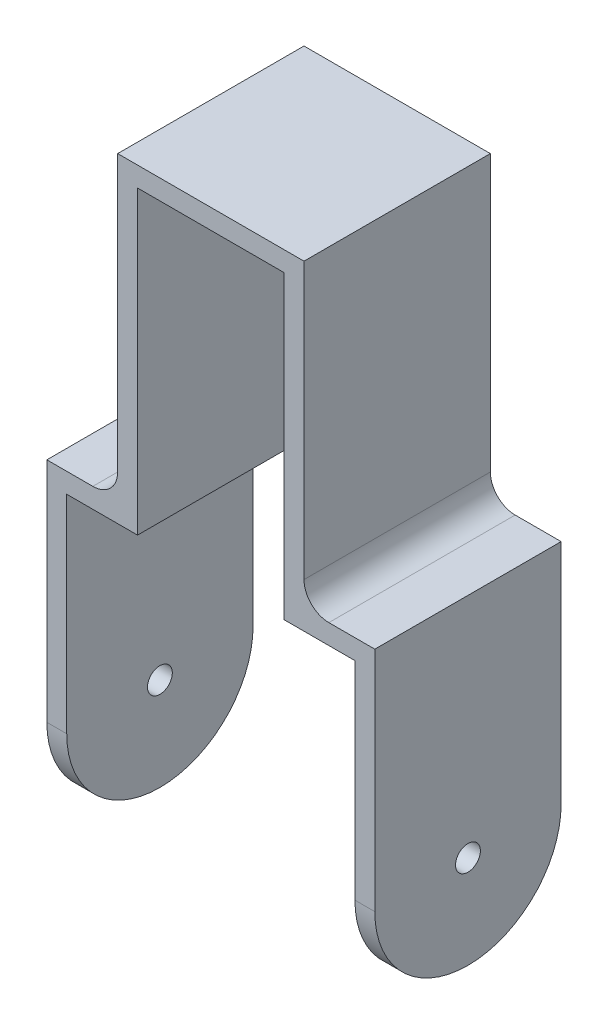
ISO-10303-21;
HEADER;
FILE_DESCRIPTION(('STEP AP214'),'2;1');
FILE_NAME('part.step','',(''),(''),'','','');
FILE_SCHEMA(('AUTOMOTIVE_DESIGN { 1 0 10303 214 1 1 1 1 }'));
ENDSEC;
DATA;
#1=APPLICATION_CONTEXT('core data for automotive mechanical design processes');
#2=APPLICATION_PROTOCOL_DEFINITION('international standard','automotive_design',2000,#1);
#3=PRODUCT_CONTEXT('',#1,'mechanical');
#4=PRODUCT('Part','Part','',(#3));
#5=PRODUCT_RELATED_PRODUCT_CATEGORY('part','',(#4));
#6=PRODUCT_DEFINITION_FORMATION('','',#4);
#7=PRODUCT_DEFINITION_CONTEXT('part definition',#1,'design');
#8=PRODUCT_DEFINITION('design','',#6,#7);
#9=PRODUCT_DEFINITION_SHAPE('','',#8);
#10=(LENGTH_UNIT() NAMED_UNIT(*) SI_UNIT(.MILLI.,.METRE.));
#11=(NAMED_UNIT(*) PLANE_ANGLE_UNIT() SI_UNIT($,.RADIAN.));
#12=(NAMED_UNIT(*) SI_UNIT($,.STERADIAN.) SOLID_ANGLE_UNIT());
#13=UNCERTAINTY_MEASURE_WITH_UNIT(LENGTH_MEASURE(1.E-05),#10,'distance_accuracy_value','');
#14=(GEOMETRIC_REPRESENTATION_CONTEXT(3) GLOBAL_UNCERTAINTY_ASSIGNED_CONTEXT((#13)) GLOBAL_UNIT_ASSIGNED_CONTEXT((#10,
#11,#12)) REPRESENTATION_CONTEXT('',''));
#15=CARTESIAN_POINT('',(0.,0.,0.));
#16=DIRECTION('',(0.,0.,1.));
#17=DIRECTION('',(1.,0.,0.));
#18=AXIS2_PLACEMENT_3D('',#15,#16,#17);
#19=CARTESIAN_POINT('',(-20.5,0.,75.));
#20=DIRECTION('',(1.,0.,0.));
#21=DIRECTION('',(0.,1.,0.));
#22=AXIS2_PLACEMENT_3D('',#19,#20,#21);
#23=PLANE('',#22);
#24=CARTESIAN_POINT('',(-20.5,-212.5,37.5));
#25=DIRECTION('',(1.,0.,0.));
#26=DIRECTION('',(0.,1.,0.));
#27=AXIS2_PLACEMENT_3D('',#24,#25,#26);
#28=CIRCLE('',#27,5.);
#29=CARTESIAN_POINT('',(-20.5,-207.5,37.5));
#30=VERTEX_POINT('',#29);
#31=EDGE_CURVE('E234',#30,#30,#28,.F.);
#32=ORIENTED_EDGE('',*,*,#31,.T.);
#33=EDGE_LOOP('',(#32));
#34=FACE_BOUND('',#33,.T.);
#35=DIRECTION('',(0.,-1.,0.));
#36=VECTOR('',#35,1.);
#37=CARTESIAN_POINT('',(-20.5,0.,75.));
#38=LINE('',#37,#36);
#39=CARTESIAN_POINT('',(-20.5,-129.,75.));
#40=VERTEX_POINT('',#39);
#41=CARTESIAN_POINT('',(-20.5,-212.5,75.));
#42=VERTEX_POINT('',#41);
#43=EDGE_CURVE('E174',#40,#42,#38,.T.);
#44=ORIENTED_EDGE('',*,*,#43,.T.);
#45=CARTESIAN_POINT('',(-20.5,-212.5,37.5));
#46=DIRECTION('',(1.,0.,0.));
#47=DIRECTION('',(0.,1.,0.));
#48=AXIS2_PLACEMENT_3D('',#45,#46,#47);
#49=CIRCLE('',#48,37.5);
#50=CARTESIAN_POINT('',(-20.5,-250.,37.5));
#51=VERTEX_POINT('',#50);
#52=EDGE_CURVE('E299',#42,#51,#49,.T.);
#53=ORIENTED_EDGE('',*,*,#52,.T.);
#54=CARTESIAN_POINT('',(-20.5,-212.5,37.5));
#55=DIRECTION('',(1.,0.,0.));
#56=DIRECTION('',(0.,1.,0.));
#57=AXIS2_PLACEMENT_3D('',#54,#55,#56);
#58=CIRCLE('',#57,37.5);
#59=CARTESIAN_POINT('',(-20.5,-212.5,0.));
#60=VERTEX_POINT('',#59);
#61=EDGE_CURVE('E297',#51,#60,#58,.T.);
#62=ORIENTED_EDGE('',*,*,#61,.T.);
#63=DIRECTION('',(0.,-1.,0.));
#64=VECTOR('',#63,1.);
#65=CARTESIAN_POINT('',(-20.5,0.,0.));
#66=LINE('',#65,#64);
#67=CARTESIAN_POINT('',(-20.5,-129.,0.));
#68=VERTEX_POINT('',#67);
#69=EDGE_CURVE('E176',#68,#60,#66,.T.);
#70=ORIENTED_EDGE('',*,*,#69,.F.);
#71=DIRECTION('',(0.,0.,-1.));
#72=VECTOR('',#71,1.);
#73=CARTESIAN_POINT('',(-20.5,-129.,75.));
#74=LINE('',#73,#72);
#75=EDGE_CURVE('E172',#40,#68,#74,.T.);
#76=ORIENTED_EDGE('',*,*,#75,.F.);
#77=EDGE_LOOP('',(#44,#53,#62,#70,#76));
#78=FACE_BOUND('',#77,.T.);
#79=ADVANCED_FACE('F35',(#34,#78),#23,.T.);
#80=CARTESIAN_POINT('',(1.25630500154952E-13,-129.,75.));
#81=DIRECTION('',(0.,-1.,0.));
#82=DIRECTION('',(1.,0.,0.));
#83=AXIS2_PLACEMENT_3D('',#80,#81,#82);
#84=PLANE('',#83);
#85=DIRECTION('',(-1.,0.,0.));
#86=VECTOR('',#85,1.);
#87=CARTESIAN_POINT('',(1.25630500154952E-13,-129.,0.));
#88=LINE('',#87,#86);
#89=CARTESIAN_POINT('',(8.00000000000002,-129.,0.));
#90=VERTEX_POINT('',#89);
#91=EDGE_CURVE('E233',#90,#68,#88,.T.);
#92=ORIENTED_EDGE('',*,*,#91,.F.);
#93=DIRECTION('',(0.,0.,-1.));
#94=VECTOR('',#93,1.);
#95=CARTESIAN_POINT('',(8.00000000000002,-129.,75.));
#96=LINE('',#95,#94);
#97=CARTESIAN_POINT('',(8.00000000000002,-129.,75.));
#98=VERTEX_POINT('',#97);
#99=EDGE_CURVE('E182',#98,#90,#96,.T.);
#100=ORIENTED_EDGE('',*,*,#99,.F.);
#101=DIRECTION('',(-1.,0.,0.));
#102=VECTOR('',#101,1.);
#103=CARTESIAN_POINT('',(1.25630500154952E-13,-129.,75.));
#104=LINE('',#103,#102);
#105=EDGE_CURVE('E190',#98,#40,#104,.T.);
#106=ORIENTED_EDGE('',*,*,#105,.T.);
#107=ORIENTED_EDGE('',*,*,#75,.T.);
#108=EDGE_LOOP('',(#92,#100,#106,#107));
#109=FACE_BOUND('',#108,.T.);
#110=ADVANCED_FACE('F196',(#109),#84,.T.);
#111=CARTESIAN_POINT('',(8.,0.,75.));
#112=DIRECTION('',(1.,0.,0.));
#113=DIRECTION('',(0.,1.,0.));
#114=AXIS2_PLACEMENT_3D('',#111,#112,#113);
#115=PLANE('',#114);
#116=DIRECTION('',(0.,-1.,0.));
#117=VECTOR('',#116,1.);
#118=CARTESIAN_POINT('',(8.,0.,0.));
#119=LINE('',#118,#117);
#120=CARTESIAN_POINT('',(8.,-8.00000000000001,0.));
#121=VERTEX_POINT('',#120);
#122=EDGE_CURVE('E236',#121,#90,#119,.T.);
#123=ORIENTED_EDGE('',*,*,#122,.F.);
#124=DIRECTION('',(0.,0.,-1.));
#125=VECTOR('',#124,1.);
#126=CARTESIAN_POINT('',(8.,-8.00000000000001,75.));
#127=LINE('',#126,#125);
#128=CARTESIAN_POINT('',(8.,-8.00000000000001,75.));
#129=VERTEX_POINT('',#128);
#130=EDGE_CURVE('E282',#129,#121,#127,.T.);
#131=ORIENTED_EDGE('',*,*,#130,.F.);
#132=DIRECTION('',(0.,-1.,0.));
#133=VECTOR('',#132,1.);
#134=CARTESIAN_POINT('',(8.,0.,75.));
#135=LINE('',#134,#133);
#136=EDGE_CURVE('E197',#129,#98,#135,.T.);
#137=ORIENTED_EDGE('',*,*,#136,.T.);
#138=ORIENTED_EDGE('',*,*,#99,.T.);
#139=EDGE_LOOP('',(#123,#131,#137,#138));
#140=FACE_BOUND('',#139,.T.);
#141=ADVANCED_FACE('F391',(#140),#115,.T.);
#142=CARTESIAN_POINT('',(0.,-8.00000000000001,75.));
#143=DIRECTION('',(0.,-1.,0.));
#144=DIRECTION('',(1.,0.,0.));
#145=AXIS2_PLACEMENT_3D('',#142,#143,#144);
#146=PLANE('',#145);
#147=DIRECTION('',(-1.,0.,0.));
#148=VECTOR('',#147,1.);
#149=CARTESIAN_POINT('',(0.,-8.00000000000001,0.));
#150=LINE('',#149,#148);
#151=CARTESIAN_POINT('',(67.,-8.,0.));
#152=VERTEX_POINT('',#151);
#153=EDGE_CURVE('E239',#152,#121,#150,.T.);
#154=ORIENTED_EDGE('',*,*,#153,.F.);
#155=DIRECTION('',(0.,0.,-1.));
#156=VECTOR('',#155,1.);
#157=CARTESIAN_POINT('',(67.,-8.,75.));
#158=LINE('',#157,#156);
#159=CARTESIAN_POINT('',(67.,-8.,75.));
#160=VERTEX_POINT('',#159);
#161=EDGE_CURVE('E280',#160,#152,#158,.T.);
#162=ORIENTED_EDGE('',*,*,#161,.F.);
#163=DIRECTION('',(-1.,0.,0.));
#164=VECTOR('',#163,1.);
#165=CARTESIAN_POINT('',(0.,-8.00000000000001,75.));
#166=LINE('',#165,#164);
#167=EDGE_CURVE('E199',#160,#129,#166,.T.);
#168=ORIENTED_EDGE('',*,*,#167,.T.);
#169=ORIENTED_EDGE('',*,*,#130,.T.);
#170=EDGE_LOOP('',(#154,#162,#168,#169));
#171=FACE_BOUND('',#170,.T.);
#172=ADVANCED_FACE('F388',(#171),#146,.T.);
#173=CARTESIAN_POINT('',(67.,0.,75.));
#174=DIRECTION('',(1.,0.,0.));
#175=DIRECTION('',(0.,1.,0.));
#176=AXIS2_PLACEMENT_3D('',#173,#174,#175);
#177=PLANE('',#176);
#178=DIRECTION('',(0.,-1.,0.));
#179=VECTOR('',#178,1.);
#180=CARTESIAN_POINT('',(67.,0.,0.));
#181=LINE('',#180,#179);
#182=CARTESIAN_POINT('',(67.,-129.,0.));
#183=VERTEX_POINT('',#182);
#184=EDGE_CURVE('E242',#152,#183,#181,.T.);
#185=ORIENTED_EDGE('',*,*,#184,.T.);
#186=DIRECTION('',(0.,0.,-1.));
#187=VECTOR('',#186,1.);
#188=CARTESIAN_POINT('',(67.,-129.,75.));
#189=LINE('',#188,#187);
#190=CARTESIAN_POINT('',(67.,-129.,75.));
#191=VERTEX_POINT('',#190);
#192=EDGE_CURVE('E278',#191,#183,#189,.T.);
#193=ORIENTED_EDGE('',*,*,#192,.F.);
#194=DIRECTION('',(0.,-1.,0.));
#195=VECTOR('',#194,1.);
#196=CARTESIAN_POINT('',(67.,0.,75.));
#197=LINE('',#196,#195);
#198=EDGE_CURVE('E205',#160,#191,#197,.T.);
#199=ORIENTED_EDGE('',*,*,#198,.F.);
#200=ORIENTED_EDGE('',*,*,#161,.T.);
#201=EDGE_LOOP('',(#185,#193,#199,#200));
#202=FACE_BOUND('',#201,.T.);
#203=ADVANCED_FACE('F425',(#202),#177,.F.);
#204=CARTESIAN_POINT('',(-1.25630500154952E-13,-129.,75.));
#205=DIRECTION('',(0.,-1.,0.));
#206=DIRECTION('',(1.,0.,0.));
#207=AXIS2_PLACEMENT_3D('',#204,#205,#206);
#208=PLANE('',#207);
#209=DIRECTION('',(-1.,0.,0.));
#210=VECTOR('',#209,1.);
#211=CARTESIAN_POINT('',(-1.25630500154952E-13,-129.,0.));
#212=LINE('',#211,#210);
#213=CARTESIAN_POINT('',(95.5,-129.,0.));
#214=VERTEX_POINT('',#213);
#215=EDGE_CURVE('E245',#214,#183,#212,.T.);
#216=ORIENTED_EDGE('',*,*,#215,.F.);
#217=DIRECTION('',(0.,0.,-1.));
#218=VECTOR('',#217,1.);
#219=CARTESIAN_POINT('',(95.5,-129.,75.));
#220=LINE('',#219,#218);
#221=CARTESIAN_POINT('',(95.5,-129.,75.));
#222=VERTEX_POINT('',#221);
#223=EDGE_CURVE('E276',#222,#214,#220,.T.);
#224=ORIENTED_EDGE('',*,*,#223,.F.);
#225=DIRECTION('',(-1.,0.,0.));
#226=VECTOR('',#225,1.);
#227=CARTESIAN_POINT('',(-1.25630500154952E-13,-129.,75.));
#228=LINE('',#227,#226);
#229=EDGE_CURVE('E207',#222,#191,#228,.T.);
#230=ORIENTED_EDGE('',*,*,#229,.T.);
#231=ORIENTED_EDGE('',*,*,#192,.T.);
#232=EDGE_LOOP('',(#216,#224,#230,#231));
#233=FACE_BOUND('',#232,.T.);
#234=ADVANCED_FACE('F382',(#233),#208,.T.);
#235=CARTESIAN_POINT('',(95.5,0.,75.));
#236=DIRECTION('',(1.,0.,0.));
#237=DIRECTION('',(0.,1.,0.));
#238=AXIS2_PLACEMENT_3D('',#235,#236,#237);
#239=PLANE('',#238);
#240=CARTESIAN_POINT('',(95.5,-212.5,37.5));
#241=DIRECTION('',(1.,0.,0.));
#242=DIRECTION('',(0.,1.,0.));
#243=AXIS2_PLACEMENT_3D('',#240,#241,#242);
#244=CIRCLE('',#243,5.);
#245=CARTESIAN_POINT('',(95.5,-207.5,37.5));
#246=VERTEX_POINT('',#245);
#247=EDGE_CURVE('E465',#246,#246,#244,.F.);
#248=ORIENTED_EDGE('',*,*,#247,.F.);
#249=EDGE_LOOP('',(#248));
#250=FACE_BOUND('',#249,.T.);
#251=CARTESIAN_POINT('',(95.5,-212.5,37.5));
#252=DIRECTION('',(1.,0.,0.));
#253=DIRECTION('',(0.,1.,0.));
#254=AXIS2_PLACEMENT_3D('',#251,#252,#253);
#255=CIRCLE('',#254,37.5);
#256=CARTESIAN_POINT('',(95.5,-212.5,0.));
#257=VERTEX_POINT('',#256);
#258=CARTESIAN_POINT('',(95.5,-250.,37.5));
#259=VERTEX_POINT('',#258);
#260=EDGE_CURVE('E305',#257,#259,#255,.F.);
#261=ORIENTED_EDGE('',*,*,#260,.T.);
#262=CARTESIAN_POINT('',(95.5,-212.5,37.5));
#263=DIRECTION('',(1.,0.,0.));
#264=DIRECTION('',(0.,1.,0.));
#265=AXIS2_PLACEMENT_3D('',#262,#263,#264);
#266=CIRCLE('',#265,37.5);
#267=CARTESIAN_POINT('',(95.5,-212.5,75.));
#268=VERTEX_POINT('',#267);
#269=EDGE_CURVE('E307',#259,#268,#266,.F.);
#270=ORIENTED_EDGE('',*,*,#269,.T.);
#271=DIRECTION('',(0.,-1.,0.));
#272=VECTOR('',#271,1.);
#273=CARTESIAN_POINT('',(95.5,0.,75.));
#274=LINE('',#273,#272);
#275=EDGE_CURVE('E210',#222,#268,#274,.T.);
#276=ORIENTED_EDGE('',*,*,#275,.F.);
#277=ORIENTED_EDGE('',*,*,#223,.T.);
#278=DIRECTION('',(0.,-1.,0.));
#279=VECTOR('',#278,1.);
#280=CARTESIAN_POINT('',(95.5,0.,0.));
#281=LINE('',#280,#279);
#282=EDGE_CURVE('E248',#214,#257,#281,.T.);
#283=ORIENTED_EDGE('',*,*,#282,.T.);
#284=EDGE_LOOP('',(#261,#270,#276,#277,#283));
#285=FACE_BOUND('',#284,.T.);
#286=ADVANCED_FACE('F375',(#250,#285),#239,.F.);
#287=CARTESIAN_POINT('',(103.5,0.,75.));
#288=DIRECTION('',(1.,0.,0.));
#289=DIRECTION('',(0.,1.,0.));
#290=AXIS2_PLACEMENT_3D('',#287,#288,#289);
#291=PLANE('',#290);
#292=CARTESIAN_POINT('',(103.5,-212.5,37.5));
#293=DIRECTION('',(1.,0.,0.));
#294=DIRECTION('',(0.,1.,0.));
#295=AXIS2_PLACEMENT_3D('',#292,#293,#294);
#296=CIRCLE('',#295,5.);
#297=CARTESIAN_POINT('',(103.5,-207.5,37.5));
#298=VERTEX_POINT('',#297);
#299=EDGE_CURVE('E288',#298,#298,#296,.F.);
#300=ORIENTED_EDGE('',*,*,#299,.T.);
#301=EDGE_LOOP('',(#300));
#302=FACE_BOUND('',#301,.T.);
#303=DIRECTION('',(0.,-1.,0.));
#304=VECTOR('',#303,1.);
#305=CARTESIAN_POINT('',(103.5,0.,75.));
#306=LINE('',#305,#304);
#307=CARTESIAN_POINT('',(103.5,-121.,75.));
#308=VERTEX_POINT('',#307);
#309=CARTESIAN_POINT('',(103.5,-212.5,75.));
#310=VERTEX_POINT('',#309);
#311=EDGE_CURVE('E213',#308,#310,#306,.T.);
#312=ORIENTED_EDGE('',*,*,#311,.T.);
#313=CARTESIAN_POINT('',(103.5,-212.5,37.5));
#314=DIRECTION('',(1.,0.,0.));
#315=DIRECTION('',(0.,1.,0.));
#316=AXIS2_PLACEMENT_3D('',#313,#314,#315);
#317=CIRCLE('',#316,37.5);
#318=CARTESIAN_POINT('',(103.5,-250.,37.5));
#319=VERTEX_POINT('',#318);
#320=EDGE_CURVE('E311',#310,#319,#317,.T.);
#321=ORIENTED_EDGE('',*,*,#320,.T.);
#322=CARTESIAN_POINT('',(103.5,-212.5,37.5));
#323=DIRECTION('',(1.,0.,0.));
#324=DIRECTION('',(0.,1.,0.));
#325=AXIS2_PLACEMENT_3D('',#322,#323,#324);
#326=CIRCLE('',#325,37.5);
#327=CARTESIAN_POINT('',(103.5,-212.5,0.));
#328=VERTEX_POINT('',#327);
#329=EDGE_CURVE('E309',#319,#328,#326,.T.);
#330=ORIENTED_EDGE('',*,*,#329,.T.);
#331=DIRECTION('',(0.,-1.,0.));
#332=VECTOR('',#331,1.);
#333=CARTESIAN_POINT('',(103.5,0.,0.));
#334=LINE('',#333,#332);
#335=CARTESIAN_POINT('',(103.5,-121.,0.));
#336=VERTEX_POINT('',#335);
#337=EDGE_CURVE('E251',#336,#328,#334,.T.);
#338=ORIENTED_EDGE('',*,*,#337,.F.);
#339=DIRECTION('',(0.,0.,-1.));
#340=VECTOR('',#339,1.);
#341=CARTESIAN_POINT('',(103.5,-121.,75.));
#342=LINE('',#341,#340);
#343=EDGE_CURVE('E274',#308,#336,#342,.T.);
#344=ORIENTED_EDGE('',*,*,#343,.F.);
#345=EDGE_LOOP('',(#312,#321,#330,#338,#344));
#346=FACE_BOUND('',#345,.T.);
#347=ADVANCED_FACE('F363',(#302,#346),#291,.T.);
#348=CARTESIAN_POINT('',(2.35678922771306E-13,-121.,75.));
#349=DIRECTION('',(0.,-1.,0.));
#350=DIRECTION('',(1.,0.,0.));
#351=AXIS2_PLACEMENT_3D('',#348,#349,#350);
#352=PLANE('',#351);
#353=DIRECTION('',(-1.,0.,0.));
#354=VECTOR('',#353,1.);
#355=CARTESIAN_POINT('',(2.35678922771306E-13,-121.,0.));
#356=LINE('',#355,#354);
#357=CARTESIAN_POINT('',(85.,-121.,0.));
#358=VERTEX_POINT('',#357);
#359=EDGE_CURVE('E254',#336,#358,#356,.T.);
#360=ORIENTED_EDGE('',*,*,#359,.T.);
#361=DIRECTION('',(0.,0.,-1.));
#362=VECTOR('',#361,1.);
#363=CARTESIAN_POINT('',(85.,-121.,75.));
#364=LINE('',#363,#362);
#365=CARTESIAN_POINT('',(85.,-121.,75.));
#366=VERTEX_POINT('',#365);
#367=EDGE_CURVE('E50',#358,#366,#364,.F.);
#368=ORIENTED_EDGE('',*,*,#367,.T.);
#369=DIRECTION('',(-1.,0.,0.));
#370=VECTOR('',#369,1.);
#371=CARTESIAN_POINT('',(2.35678922771306E-13,-121.,75.));
#372=LINE('',#371,#370);
#373=EDGE_CURVE('E216',#308,#366,#372,.T.);
#374=ORIENTED_EDGE('',*,*,#373,.F.);
#375=ORIENTED_EDGE('',*,*,#343,.T.);
#376=EDGE_LOOP('',(#360,#368,#374,#375));
#377=FACE_BOUND('',#376,.T.);
#378=ADVANCED_FACE('F359',(#377),#352,.F.);
#379=CARTESIAN_POINT('',(75.,0.,75.));
#380=DIRECTION('',(1.,0.,0.));
#381=DIRECTION('',(0.,1.,0.));
#382=AXIS2_PLACEMENT_3D('',#379,#380,#381);
#383=PLANE('',#382);
#384=DIRECTION('',(0.,-1.,0.));
#385=VECTOR('',#384,1.);
#386=CARTESIAN_POINT('',(75.,0.,75.));
#387=LINE('',#386,#385);
#388=CARTESIAN_POINT('',(75.,0.,75.));
#389=VERTEX_POINT('',#388);
#390=CARTESIAN_POINT('',(75.,-111.,75.));
#391=VERTEX_POINT('',#390);
#392=EDGE_CURVE('E218',#389,#391,#387,.T.);
#393=ORIENTED_EDGE('',*,*,#392,.T.);
#394=DIRECTION('',(0.,0.,-1.));
#395=VECTOR('',#394,1.);
#396=CARTESIAN_POINT('',(75.,-111.,75.));
#397=LINE('',#396,#395);
#398=CARTESIAN_POINT('',(75.,-111.,0.));
#399=VERTEX_POINT('',#398);
#400=EDGE_CURVE('E323',#391,#399,#397,.T.);
#401=ORIENTED_EDGE('',*,*,#400,.T.);
#402=DIRECTION('',(0.,-1.,0.));
#403=VECTOR('',#402,1.);
#404=CARTESIAN_POINT('',(75.,0.,0.));
#405=LINE('',#404,#403);
#406=CARTESIAN_POINT('',(75.,0.,0.));
#407=VERTEX_POINT('',#406);
#408=EDGE_CURVE('E256',#407,#399,#405,.T.);
#409=ORIENTED_EDGE('',*,*,#408,.F.);
#410=DIRECTION('',(0.,0.,-1.));
#411=VECTOR('',#410,1.);
#412=CARTESIAN_POINT('',(75.,0.,75.));
#413=LINE('',#412,#411);
#414=EDGE_CURVE('E272',#389,#407,#413,.T.);
#415=ORIENTED_EDGE('',*,*,#414,.F.);
#416=EDGE_LOOP('',(#393,#401,#409,#415));
#417=FACE_BOUND('',#416,.T.);
#418=ADVANCED_FACE('F353',(#417),#383,.T.);
#419=CARTESIAN_POINT('',(0.,0.,75.));
#420=DIRECTION('',(0.,1.,0.));
#421=DIRECTION('',(-1.,0.,0.));
#422=AXIS2_PLACEMENT_3D('',#419,#420,#421);
#423=PLANE('',#422);
#424=DIRECTION('',(1.,0.,0.));
#425=VECTOR('',#424,1.);
#426=CARTESIAN_POINT('',(0.,0.,0.));
#427=LINE('',#426,#425);
#428=CARTESIAN_POINT('',(0.,0.,0.));
#429=VERTEX_POINT('',#428);
#430=EDGE_CURVE('E258',#429,#407,#427,.T.);
#431=ORIENTED_EDGE('',*,*,#430,.F.);
#432=DIRECTION('',(0.,0.,-1.));
#433=VECTOR('',#432,1.);
#434=CARTESIAN_POINT('',(0.,0.,75.));
#435=LINE('',#434,#433);
#436=CARTESIAN_POINT('',(0.,0.,75.));
#437=VERTEX_POINT('',#436);
#438=EDGE_CURVE('E270',#437,#429,#435,.T.);
#439=ORIENTED_EDGE('',*,*,#438,.F.);
#440=DIRECTION('',(1.,0.,0.));
#441=VECTOR('',#440,1.);
#442=CARTESIAN_POINT('',(0.,0.,75.));
#443=LINE('',#442,#441);
#444=EDGE_CURVE('E221',#437,#389,#443,.T.);
#445=ORIENTED_EDGE('',*,*,#444,.T.);
#446=ORIENTED_EDGE('',*,*,#414,.T.);
#447=EDGE_LOOP('',(#431,#439,#445,#446));
#448=FACE_BOUND('',#447,.T.);
#449=ADVANCED_FACE('F350',(#448),#423,.T.);
#450=CARTESIAN_POINT('',(0.,0.,75.));
#451=DIRECTION('',(1.,0.,0.));
#452=DIRECTION('',(0.,1.,0.));
#453=AXIS2_PLACEMENT_3D('',#450,#451,#452);
#454=PLANE('',#453);
#455=DIRECTION('',(0.,-1.,0.));
#456=VECTOR('',#455,1.);
#457=CARTESIAN_POINT('',(0.,0.,0.));
#458=LINE('',#457,#456);
#459=CARTESIAN_POINT('',(0.,-111.,0.));
#460=VERTEX_POINT('',#459);
#461=EDGE_CURVE('E261',#429,#460,#458,.T.);
#462=ORIENTED_EDGE('',*,*,#461,.T.);
#463=DIRECTION('',(0.,0.,-1.));
#464=VECTOR('',#463,1.);
#465=CARTESIAN_POINT('',(0.,-111.,75.));
#466=LINE('',#465,#464);
#467=CARTESIAN_POINT('',(0.,-111.,75.));
#468=VERTEX_POINT('',#467);
#469=EDGE_CURVE('E321',#460,#468,#466,.F.);
#470=ORIENTED_EDGE('',*,*,#469,.T.);
#471=DIRECTION('',(0.,-1.,0.));
#472=VECTOR('',#471,1.);
#473=CARTESIAN_POINT('',(0.,0.,75.));
#474=LINE('',#473,#472);
#475=EDGE_CURVE('E224',#437,#468,#474,.T.);
#476=ORIENTED_EDGE('',*,*,#475,.F.);
#477=ORIENTED_EDGE('',*,*,#438,.T.);
#478=EDGE_LOOP('',(#462,#470,#476,#477));
#479=FACE_BOUND('',#478,.T.);
#480=ADVANCED_FACE('F348',(#479),#454,.F.);
#481=CARTESIAN_POINT('',(-1.17839461385653E-13,-121.,75.));
#482=DIRECTION('',(0.,-1.,0.));
#483=DIRECTION('',(1.,0.,0.));
#484=AXIS2_PLACEMENT_3D('',#481,#482,#483);
#485=PLANE('',#484);
#486=DIRECTION('',(-1.,0.,0.));
#487=VECTOR('',#486,1.);
#488=CARTESIAN_POINT('',(-1.17839461385653E-13,-121.,75.));
#489=LINE('',#488,#487);
#490=CARTESIAN_POINT('',(-10.,-121.,75.));
#491=VERTEX_POINT('',#490);
#492=CARTESIAN_POINT('',(-28.5,-121.,75.));
#493=VERTEX_POINT('',#492);
#494=EDGE_CURVE('E227',#491,#493,#489,.T.);
#495=ORIENTED_EDGE('',*,*,#494,.F.);
#496=DIRECTION('',(0.,0.,-1.));
#497=VECTOR('',#496,1.);
#498=CARTESIAN_POINT('',(-10.,-121.,0.));
#499=LINE('',#498,#497);
#500=CARTESIAN_POINT('',(-10.,-121.,0.));
#501=VERTEX_POINT('',#500);
#502=EDGE_CURVE('E313',#491,#501,#499,.T.);
#503=ORIENTED_EDGE('',*,*,#502,.T.);
#504=DIRECTION('',(-1.,0.,0.));
#505=VECTOR('',#504,1.);
#506=CARTESIAN_POINT('',(-1.17839461385653E-13,-121.,0.));
#507=LINE('',#506,#505);
#508=CARTESIAN_POINT('',(-28.5,-121.,0.));
#509=VERTEX_POINT('',#508);
#510=EDGE_CURVE('E264',#501,#509,#507,.T.);
#511=ORIENTED_EDGE('',*,*,#510,.T.);
#512=DIRECTION('',(0.,0.,-1.));
#513=VECTOR('',#512,1.);
#514=CARTESIAN_POINT('',(-28.5,-121.,75.));
#515=LINE('',#514,#513);
#516=EDGE_CURVE('E231',#493,#509,#515,.T.);
#517=ORIENTED_EDGE('',*,*,#516,.F.);
#518=EDGE_LOOP('',(#495,#503,#511,#517));
#519=FACE_BOUND('',#518,.T.);
#520=ADVANCED_FACE('F339',(#519),#485,.F.);
#521=CARTESIAN_POINT('',(-28.5,0.,75.));
#522=DIRECTION('',(1.,0.,0.));
#523=DIRECTION('',(0.,1.,0.));
#524=AXIS2_PLACEMENT_3D('',#521,#522,#523);
#525=PLANE('',#524);
#526=CARTESIAN_POINT('',(-28.5,-212.5,37.5));
#527=DIRECTION('',(1.,0.,0.));
#528=DIRECTION('',(0.,1.,0.));
#529=AXIS2_PLACEMENT_3D('',#526,#527,#528);
#530=CIRCLE('',#529,5.);
#531=CARTESIAN_POINT('',(-28.5,-207.5,37.5));
#532=VERTEX_POINT('',#531);
#533=EDGE_CURVE('E285',#532,#532,#530,.F.);
#534=ORIENTED_EDGE('',*,*,#533,.F.);
#535=EDGE_LOOP('',(#534));
#536=FACE_BOUND('',#535,.T.);
#537=CARTESIAN_POINT('',(-28.5,-212.5,37.5));
#538=DIRECTION('',(1.,0.,0.));
#539=DIRECTION('',(0.,1.,0.));
#540=AXIS2_PLACEMENT_3D('',#537,#538,#539);
#541=CIRCLE('',#540,37.5);
#542=CARTESIAN_POINT('',(-28.5,-212.5,0.));
#543=VERTEX_POINT('',#542);
#544=CARTESIAN_POINT('',(-28.5,-250.,37.5));
#545=VERTEX_POINT('',#544);
#546=EDGE_CURVE('E181',#543,#545,#541,.F.);
#547=ORIENTED_EDGE('',*,*,#546,.T.);
#548=CARTESIAN_POINT('',(-28.5,-212.5,37.5));
#549=DIRECTION('',(1.,0.,0.));
#550=DIRECTION('',(0.,1.,0.));
#551=AXIS2_PLACEMENT_3D('',#548,#549,#550);
#552=CIRCLE('',#551,37.5);
#553=CARTESIAN_POINT('',(-28.5,-212.5,75.));
#554=VERTEX_POINT('',#553);
#555=EDGE_CURVE('E291',#545,#554,#552,.F.);
#556=ORIENTED_EDGE('',*,*,#555,.T.);
#557=DIRECTION('',(0.,-1.,0.));
#558=VECTOR('',#557,1.);
#559=CARTESIAN_POINT('',(-28.5,0.,75.));
#560=LINE('',#559,#558);
#561=EDGE_CURVE('E229',#493,#554,#560,.T.);
#562=ORIENTED_EDGE('',*,*,#561,.F.);
#563=ORIENTED_EDGE('',*,*,#516,.T.);
#564=DIRECTION('',(0.,-1.,0.));
#565=VECTOR('',#564,1.);
#566=CARTESIAN_POINT('',(-28.5,0.,0.));
#567=LINE('',#566,#565);
#568=EDGE_CURVE('E194',#509,#543,#567,.T.);
#569=ORIENTED_EDGE('',*,*,#568,.T.);
#570=EDGE_LOOP('',(#547,#556,#562,#563,#569));
#571=FACE_BOUND('',#570,.T.);
#572=ADVANCED_FACE('F400',(#536,#571),#525,.F.);
#573=CARTESIAN_POINT('',(0.,0.,75.));
#574=DIRECTION('',(0.,0.,1.));
#575=DIRECTION('',(1.,0.,0.));
#576=AXIS2_PLACEMENT_3D('',#573,#574,#575);
#577=PLANE('',#576);
#578=ORIENTED_EDGE('',*,*,#561,.T.);
#579=DIRECTION('',(-1.,0.,0.));
#580=VECTOR('',#579,1.);
#581=CARTESIAN_POINT('',(-1.47451495458029E-12,-212.5,75.));
#582=LINE('',#581,#580);
#583=EDGE_CURVE('E193',#554,#42,#582,.F.);
#584=ORIENTED_EDGE('',*,*,#583,.T.);
#585=ORIENTED_EDGE('',*,*,#43,.F.);
#586=ORIENTED_EDGE('',*,*,#105,.F.);
#587=ORIENTED_EDGE('',*,*,#136,.F.);
#588=ORIENTED_EDGE('',*,*,#167,.F.);
#589=ORIENTED_EDGE('',*,*,#198,.T.);
#590=ORIENTED_EDGE('',*,*,#229,.F.);
#591=ORIENTED_EDGE('',*,*,#275,.T.);
#592=DIRECTION('',(-1.,0.,0.));
#593=VECTOR('',#592,1.);
#594=CARTESIAN_POINT('',(-2.21177243187041E-12,-212.499999999999,75.));
#595=LINE('',#594,#593);
#596=EDGE_CURVE('E293',#268,#310,#595,.F.);
#597=ORIENTED_EDGE('',*,*,#596,.T.);
#598=ORIENTED_EDGE('',*,*,#311,.F.);
#599=ORIENTED_EDGE('',*,*,#373,.T.);
#600=CARTESIAN_POINT('',(85.,-111.,75.));
#601=DIRECTION('',(0.,0.,1.));
#602=DIRECTION('',(1.,0.,0.));
#603=AXIS2_PLACEMENT_3D('',#600,#601,#602);
#604=CIRCLE('',#603,10.);
#605=EDGE_CURVE('E11',#366,#391,#604,.F.);
#606=ORIENTED_EDGE('',*,*,#605,.T.);
#607=ORIENTED_EDGE('',*,*,#392,.F.);
#608=ORIENTED_EDGE('',*,*,#444,.F.);
#609=ORIENTED_EDGE('',*,*,#475,.T.);
#610=CARTESIAN_POINT('',(-9.99999999999999,-111.,75.));
#611=DIRECTION('',(0.,0.,1.));
#612=DIRECTION('',(1.,0.,0.));
#613=AXIS2_PLACEMENT_3D('',#610,#611,#612);
#614=CIRCLE('',#613,10.);
#615=EDGE_CURVE('E329',#468,#491,#614,.F.);
#616=ORIENTED_EDGE('',*,*,#615,.T.);
#617=ORIENTED_EDGE('',*,*,#494,.T.);
#618=EDGE_LOOP('',(#578,#584,#585,#586,#587,#588,#589,#590,#591,#597,#598,#599,#606,#607,#608,
#609,#616,#617));
#619=FACE_BOUND('',#618,.T.);
#620=ADVANCED_FACE('F188',(#619),#577,.T.);
#621=CARTESIAN_POINT('',(0.,0.,0.));
#622=DIRECTION('',(0.,0.,1.));
#623=DIRECTION('',(1.,0.,0.));
#624=AXIS2_PLACEMENT_3D('',#621,#622,#623);
#625=PLANE('',#624);
#626=ORIENTED_EDGE('',*,*,#69,.T.);
#627=DIRECTION('',(-1.,0.,0.));
#628=VECTOR('',#627,1.);
#629=CARTESIAN_POINT('',(-28.4999999999997,-212.5,0.));
#630=LINE('',#629,#628);
#631=EDGE_CURVE('E303',#60,#543,#630,.T.);
#632=ORIENTED_EDGE('',*,*,#631,.T.);
#633=ORIENTED_EDGE('',*,*,#568,.F.);
#634=ORIENTED_EDGE('',*,*,#510,.F.);
#635=CARTESIAN_POINT('',(-9.99999999999999,-111.,0.));
#636=DIRECTION('',(0.,0.,1.));
#637=DIRECTION('',(1.,0.,0.));
#638=AXIS2_PLACEMENT_3D('',#635,#636,#637);
#639=CIRCLE('',#638,10.);
#640=EDGE_CURVE('E327',#501,#460,#639,.T.);
#641=ORIENTED_EDGE('',*,*,#640,.T.);
#642=ORIENTED_EDGE('',*,*,#461,.F.);
#643=ORIENTED_EDGE('',*,*,#430,.T.);
#644=ORIENTED_EDGE('',*,*,#408,.T.);
#645=CARTESIAN_POINT('',(85.,-111.,0.));
#646=DIRECTION('',(0.,0.,1.));
#647=DIRECTION('',(1.,0.,0.));
#648=AXIS2_PLACEMENT_3D('',#645,#646,#647);
#649=CIRCLE('',#648,10.);
#650=EDGE_CURVE('E43',#399,#358,#649,.T.);
#651=ORIENTED_EDGE('',*,*,#650,.T.);
#652=ORIENTED_EDGE('',*,*,#359,.F.);
#653=ORIENTED_EDGE('',*,*,#337,.T.);
#654=DIRECTION('',(-1.,0.,0.));
#655=VECTOR('',#654,1.);
#656=CARTESIAN_POINT('',(95.5000000000004,-212.5,0.));
#657=LINE('',#656,#655);
#658=EDGE_CURVE('E301',#328,#257,#657,.T.);
#659=ORIENTED_EDGE('',*,*,#658,.T.);
#660=ORIENTED_EDGE('',*,*,#282,.F.);
#661=ORIENTED_EDGE('',*,*,#215,.T.);
#662=ORIENTED_EDGE('',*,*,#184,.F.);
#663=ORIENTED_EDGE('',*,*,#153,.T.);
#664=ORIENTED_EDGE('',*,*,#122,.T.);
#665=ORIENTED_EDGE('',*,*,#91,.T.);
#666=EDGE_LOOP('',(#626,#632,#633,#634,#641,#642,#643,#644,#651,#652,#653,#659,#660,#661,#662,
#663,#664,#665));
#667=FACE_BOUND('',#666,.T.);
#668=ADVANCED_FACE('F344',(#667),#625,.F.);
#669=CARTESIAN_POINT('',(148.,-212.5,37.5));
#670=DIRECTION('',(-1.,0.,0.));
#671=DIRECTION('',(0.,0.,1.));
#672=AXIS2_PLACEMENT_3D('',#669,#670,#671);
#673=CYLINDRICAL_SURFACE('',#672,5.);
#674=ORIENTED_EDGE('',*,*,#31,.F.);
#675=EDGE_LOOP('',(#674));
#676=FACE_BOUND('',#675,.T.);
#677=ORIENTED_EDGE('',*,*,#533,.T.);
#678=EDGE_LOOP('',(#677));
#679=FACE_BOUND('',#678,.T.);
#680=ADVANCED_FACE('F451',(#676,#679),#673,.F.);
#681=ORIENTED_EDGE('',*,*,#299,.F.);
#682=EDGE_LOOP('',(#681));
#683=FACE_BOUND('',#682,.T.);
#684=ORIENTED_EDGE('',*,*,#247,.T.);
#685=EDGE_LOOP('',(#684));
#686=FACE_BOUND('',#685,.T.);
#687=ADVANCED_FACE('F410',(#683,#686),#673,.F.);
#688=CARTESIAN_POINT('',(-1.47451495458029E-12,-212.5,37.5));
#689=DIRECTION('',(1.,0.,0.));
#690=DIRECTION('',(0.,1.,0.));
#691=AXIS2_PLACEMENT_3D('',#688,#689,#690);
#692=CYLINDRICAL_SURFACE('',#691,37.5);
#693=ORIENTED_EDGE('',*,*,#631,.F.);
#694=ORIENTED_EDGE('',*,*,#61,.F.);
#695=DIRECTION('',(-1.,0.,0.));
#696=VECTOR('',#695,1.);
#697=CARTESIAN_POINT('',(-20.5,-250.,37.5));
#698=LINE('',#697,#696);
#699=EDGE_CURVE('E289',#545,#51,#698,.F.);
#700=ORIENTED_EDGE('',*,*,#699,.F.);
#701=ORIENTED_EDGE('',*,*,#546,.F.);
#702=EDGE_LOOP('',(#693,#694,#700,#701));
#703=FACE_BOUND('',#702,.T.);
#704=ADVANCED_FACE('F396',(#703),#692,.T.);
#705=CARTESIAN_POINT('',(-1.47451495458029E-12,-212.5,37.5));
#706=DIRECTION('',(-1.,0.,0.));
#707=DIRECTION('',(0.,-1.,0.));
#708=AXIS2_PLACEMENT_3D('',#705,#706,#707);
#709=CYLINDRICAL_SURFACE('',#708,37.5);
#710=ORIENTED_EDGE('',*,*,#52,.F.);
#711=ORIENTED_EDGE('',*,*,#583,.F.);
#712=ORIENTED_EDGE('',*,*,#555,.F.);
#713=ORIENTED_EDGE('',*,*,#699,.T.);
#714=EDGE_LOOP('',(#710,#711,#712,#713));
#715=FACE_BOUND('',#714,.T.);
#716=ADVANCED_FACE('F402',(#715),#709,.T.);
#717=CARTESIAN_POINT('',(-2.21177243187041E-12,-212.499999999999,37.5));
#718=DIRECTION('',(1.,0.,0.));
#719=DIRECTION('',(0.,1.,0.));
#720=AXIS2_PLACEMENT_3D('',#717,#718,#719);
#721=CYLINDRICAL_SURFACE('',#720,37.5);
#722=ORIENTED_EDGE('',*,*,#658,.F.);
#723=ORIENTED_EDGE('',*,*,#329,.F.);
#724=DIRECTION('',(-1.,0.,0.));
#725=VECTOR('',#724,1.);
#726=CARTESIAN_POINT('',(103.5,-250.,37.5));
#727=LINE('',#726,#725);
#728=EDGE_CURVE('E316',#259,#319,#727,.F.);
#729=ORIENTED_EDGE('',*,*,#728,.F.);
#730=ORIENTED_EDGE('',*,*,#260,.F.);
#731=EDGE_LOOP('',(#722,#723,#729,#730));
#732=FACE_BOUND('',#731,.T.);
#733=ADVANCED_FACE('F367',(#732),#721,.T.);
#734=CARTESIAN_POINT('',(-2.21177243187041E-12,-212.499999999999,37.5));
#735=DIRECTION('',(-1.,0.,0.));
#736=DIRECTION('',(0.,-1.,0.));
#737=AXIS2_PLACEMENT_3D('',#734,#735,#736);
#738=CYLINDRICAL_SURFACE('',#737,37.5);
#739=ORIENTED_EDGE('',*,*,#320,.F.);
#740=ORIENTED_EDGE('',*,*,#596,.F.);
#741=ORIENTED_EDGE('',*,*,#269,.F.);
#742=ORIENTED_EDGE('',*,*,#728,.T.);
#743=EDGE_LOOP('',(#739,#740,#741,#742));
#744=FACE_BOUND('',#743,.T.);
#745=ADVANCED_FACE('F371',(#744),#738,.T.);
#746=CARTESIAN_POINT('',(-9.99999999999999,-111.,75.));
#747=DIRECTION('',(0.,0.,1.));
#748=DIRECTION('',(1.,0.,0.));
#749=AXIS2_PLACEMENT_3D('',#746,#747,#748);
#750=CYLINDRICAL_SURFACE('',#749,10.);
#751=ORIENTED_EDGE('',*,*,#615,.F.);
#752=ORIENTED_EDGE('',*,*,#469,.F.);
#753=ORIENTED_EDGE('',*,*,#640,.F.);
#754=ORIENTED_EDGE('',*,*,#502,.F.);
#755=EDGE_LOOP('',(#751,#752,#753,#754));
#756=FACE_BOUND('',#755,.T.);
#757=ADVANCED_FACE('F342',(#756),#750,.F.);
#758=CARTESIAN_POINT('',(85.,-111.,75.));
#759=DIRECTION('',(0.,0.,-1.));
#760=DIRECTION('',(-1.,0.,0.));
#761=AXIS2_PLACEMENT_3D('',#758,#759,#760);
#762=CYLINDRICAL_SURFACE('',#761,10.);
#763=ORIENTED_EDGE('',*,*,#605,.F.);
#764=ORIENTED_EDGE('',*,*,#367,.F.);
#765=ORIENTED_EDGE('',*,*,#650,.F.);
#766=ORIENTED_EDGE('',*,*,#400,.F.);
#767=EDGE_LOOP('',(#763,#764,#765,#766));
#768=FACE_BOUND('',#767,.T.);
#769=ADVANCED_FACE('F37',(#768),#762,.F.);
#770=CLOSED_SHELL('',(#79,#110,#141,#172,#203,#234,#286,#347,#378,#418,#449,#480,#520,#572,#620,
#668,#680,#687,#704,#716,#733,#745,#757,#769));
#771=MANIFOLD_SOLID_BREP('B2',#770);
#772=ADVANCED_BREP_SHAPE_REPRESENTATION('',(#18,#771),#14);
#773=SHAPE_DEFINITION_REPRESENTATION(#9,#772);
ENDSEC;
END-ISO-10303-21;
